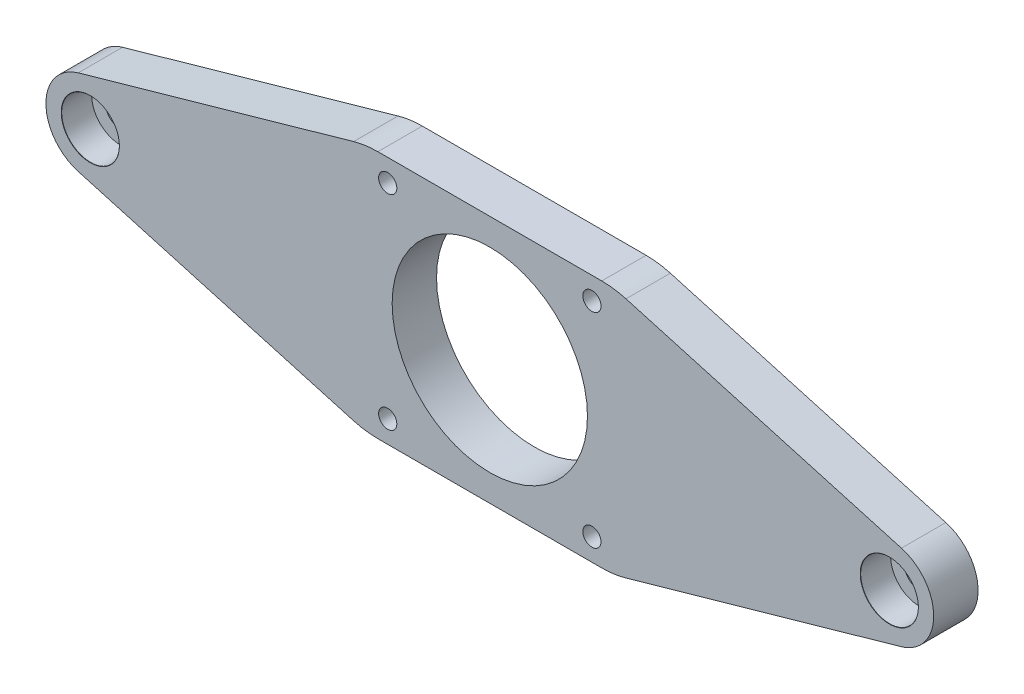
ISO-10303-21;
HEADER;
FILE_DESCRIPTION(('STEP AP214'),'2;1');
FILE_NAME('part.step','',(''),(''),'','','');
FILE_SCHEMA(('AUTOMOTIVE_DESIGN { 1 0 10303 214 1 1 1 1 }'));
ENDSEC;
DATA;
#1=APPLICATION_CONTEXT('core data for automotive mechanical design processes');
#2=APPLICATION_PROTOCOL_DEFINITION('international standard','automotive_design',2000,#1);
#3=PRODUCT_CONTEXT('',#1,'mechanical');
#4=PRODUCT('Part','Part','',(#3));
#5=PRODUCT_RELATED_PRODUCT_CATEGORY('part','',(#4));
#6=PRODUCT_DEFINITION_FORMATION('','',#4);
#7=PRODUCT_DEFINITION_CONTEXT('part definition',#1,'design');
#8=PRODUCT_DEFINITION('design','',#6,#7);
#9=PRODUCT_DEFINITION_SHAPE('','',#8);
#10=(LENGTH_UNIT() NAMED_UNIT(*) SI_UNIT(.MILLI.,.METRE.));
#11=(NAMED_UNIT(*) PLANE_ANGLE_UNIT() SI_UNIT($,.RADIAN.));
#12=(NAMED_UNIT(*) SI_UNIT($,.STERADIAN.) SOLID_ANGLE_UNIT());
#13=UNCERTAINTY_MEASURE_WITH_UNIT(LENGTH_MEASURE(1.E-05),#10,'distance_accuracy_value','');
#14=(GEOMETRIC_REPRESENTATION_CONTEXT(3) GLOBAL_UNCERTAINTY_ASSIGNED_CONTEXT((#13)) GLOBAL_UNIT_ASSIGNED_CONTEXT((#10,
#11,#12)) REPRESENTATION_CONTEXT('',''));
#15=CARTESIAN_POINT('',(0.,0.,0.));
#16=DIRECTION('',(0.,0.,1.));
#17=DIRECTION('',(1.,0.,0.));
#18=AXIS2_PLACEMENT_3D('',#15,#16,#17);
#19=CARTESIAN_POINT('',(-45.,0.,5.));
#20=DIRECTION('',(0.,0.,-1.));
#21=DIRECTION('',(-1.,0.,0.));
#22=AXIS2_PLACEMENT_3D('',#19,#20,#21);
#23=CYLINDRICAL_SURFACE('',#22,5.);
#24=CARTESIAN_POINT('',(-45.,0.,0.));
#25=DIRECTION('',(0.,0.,-1.));
#26=DIRECTION('',(-1.,0.,0.));
#27=AXIS2_PLACEMENT_3D('',#24,#25,#26);
#28=CIRCLE('',#27,5.);
#29=CARTESIAN_POINT('',(-46.3657429021405,-4.8098592833109,0.));
#30=VERTEX_POINT('',#29);
#31=CARTESIAN_POINT('',(-46.3657429021404,4.80985928331099,0.));
#32=VERTEX_POINT('',#31);
#33=EDGE_CURVE('E199',#30,#32,#28,.T.);
#34=ORIENTED_EDGE('',*,*,#33,.F.);
#35=DIRECTION('',(0.,0.,-1.));
#36=VECTOR('',#35,1.);
#37=CARTESIAN_POINT('',(-46.3657429021405,-4.8098592833109,5.));
#38=LINE('',#37,#36);
#39=CARTESIAN_POINT('',(-46.3657429021405,-4.8098592833109,5.));
#40=VERTEX_POINT('',#39);
#41=EDGE_CURVE('E183',#40,#30,#38,.T.);
#42=ORIENTED_EDGE('',*,*,#41,.F.);
#43=CARTESIAN_POINT('',(-45.,0.,5.));
#44=DIRECTION('',(0.,0.,-1.));
#45=DIRECTION('',(-1.,0.,0.));
#46=AXIS2_PLACEMENT_3D('',#43,#44,#45);
#47=CIRCLE('',#46,5.);
#48=CARTESIAN_POINT('',(-46.3657429021404,4.80985928331099,5.));
#49=VERTEX_POINT('',#48);
#50=EDGE_CURVE('E200',#40,#49,#47,.T.);
#51=ORIENTED_EDGE('',*,*,#50,.T.);
#52=DIRECTION('',(0.,0.,-1.));
#53=VECTOR('',#52,1.);
#54=CARTESIAN_POINT('',(-46.3657429021404,4.80985928331099,5.));
#55=LINE('',#54,#53);
#56=EDGE_CURVE('E212',#49,#32,#55,.T.);
#57=ORIENTED_EDGE('',*,*,#56,.T.);
#58=EDGE_LOOP('',(#34,#42,#51,#57));
#59=FACE_BOUND('',#58,.T.);
#60=ADVANCED_FACE('F37',(#59),#23,.T.);
#61=CARTESIAN_POINT('',(0.,0.,5.));
#62=DIRECTION('',(0.,0.,-1.));
#63=DIRECTION('',(-1.,0.,0.));
#64=AXIS2_PLACEMENT_3D('',#61,#62,#63);
#65=CYLINDRICAL_SURFACE('',#64,11.);
#66=CARTESIAN_POINT('',(0.,0.,0.));
#67=DIRECTION('',(0.,0.,-1.));
#68=DIRECTION('',(-1.,0.,0.));
#69=AXIS2_PLACEMENT_3D('',#66,#67,#68);
#70=CIRCLE('',#69,11.);
#71=CARTESIAN_POINT('',(-11.,0.,0.));
#72=VERTEX_POINT('',#71);
#73=EDGE_CURVE('E204',#72,#72,#70,.T.);
#74=ORIENTED_EDGE('',*,*,#73,.T.);
#75=EDGE_LOOP('',(#74));
#76=FACE_BOUND('',#75,.T.);
#77=CARTESIAN_POINT('',(0.,0.,5.));
#78=DIRECTION('',(0.,0.,-1.));
#79=DIRECTION('',(-1.,0.,0.));
#80=AXIS2_PLACEMENT_3D('',#77,#78,#79);
#81=CIRCLE('',#80,11.);
#82=CARTESIAN_POINT('',(-11.,0.,5.));
#83=VERTEX_POINT('',#82);
#84=EDGE_CURVE('E209',#83,#83,#81,.T.);
#85=ORIENTED_EDGE('',*,*,#84,.F.);
#86=EDGE_LOOP('',(#85));
#87=FACE_BOUND('',#86,.T.);
#88=ADVANCED_FACE('F327',(#76,#87),#65,.F.);
#89=CARTESIAN_POINT('',(-14.,14.,5.));
#90=DIRECTION('',(0.,1.,0.));
#91=DIRECTION('',(0.,0.,1.));
#92=AXIS2_PLACEMENT_3D('',#89,#90,#91);
#93=PLANE('',#92);
#94=DIRECTION('',(1.,0.,0.));
#95=VECTOR('',#94,1.);
#96=CARTESIAN_POINT('',(-14.,14.,0.));
#97=LINE('',#96,#95);
#98=CARTESIAN_POINT('',(-12.6077854302519,14.,0.));
#99=VERTEX_POINT('',#98);
#100=CARTESIAN_POINT('',(12.6077854302519,13.9999999999999,0.));
#101=VERTEX_POINT('',#100);
#102=EDGE_CURVE('E217',#99,#101,#97,.T.);
#103=ORIENTED_EDGE('',*,*,#102,.F.);
#104=DIRECTION('',(0.,0.,-1.));
#105=VECTOR('',#104,1.);
#106=CARTESIAN_POINT('',(-12.6077854302519,14.,5.));
#107=LINE('',#106,#105);
#108=CARTESIAN_POINT('',(-12.6077854302519,14.,5.));
#109=VERTEX_POINT('',#108);
#110=EDGE_CURVE('E46',#99,#109,#107,.F.);
#111=ORIENTED_EDGE('',*,*,#110,.T.);
#112=DIRECTION('',(1.,0.,0.));
#113=VECTOR('',#112,1.);
#114=CARTESIAN_POINT('',(-14.,14.,5.));
#115=LINE('',#114,#113);
#116=CARTESIAN_POINT('',(12.6077854302519,13.9999999999999,5.));
#117=VERTEX_POINT('',#116);
#118=EDGE_CURVE('E207',#109,#117,#115,.T.);
#119=ORIENTED_EDGE('',*,*,#118,.T.);
#120=DIRECTION('',(0.,0.,-1.));
#121=VECTOR('',#120,1.);
#122=CARTESIAN_POINT('',(12.6077854302519,13.9999999999999,5.));
#123=LINE('',#122,#121);
#124=EDGE_CURVE('E171',#101,#117,#123,.F.);
#125=ORIENTED_EDGE('',*,*,#124,.F.);
#126=EDGE_LOOP('',(#103,#111,#119,#125));
#127=FACE_BOUND('',#126,.T.);
#128=ADVANCED_FACE('F301',(#127),#93,.T.);
#129=CARTESIAN_POINT('',(-46.3657429021404,4.80985928331099,5.));
#130=DIRECTION('',(-0.27314858042809,0.9619718566622,0.));
#131=DIRECTION('',(-0.9619718566622,-0.27314858042809,0.));
#132=AXIS2_PLACEMENT_3D('',#129,#130,#131);
#133=PLANE('',#132);
#134=DIRECTION('',(0.9619718566622,0.27314858042809,0.));
#135=VECTOR('',#134,1.);
#136=CARTESIAN_POINT('',(-46.3657429021404,4.80985928331099,5.));
#137=LINE('',#136,#135);
#138=CARTESIAN_POINT('',(-15.3392712345328,13.619718566622,5.));
#139=VERTEX_POINT('',#138);
#140=EDGE_CURVE('E203',#49,#139,#137,.T.);
#141=ORIENTED_EDGE('',*,*,#140,.T.);
#142=DIRECTION('',(0.,0.,-1.));
#143=VECTOR('',#142,1.);
#144=CARTESIAN_POINT('',(-15.3392712345328,13.619718566622,5.));
#145=LINE('',#144,#143);
#146=CARTESIAN_POINT('',(-15.3392712345328,13.619718566622,0.));
#147=VERTEX_POINT('',#146);
#148=EDGE_CURVE('E222',#139,#147,#145,.T.);
#149=ORIENTED_EDGE('',*,*,#148,.T.);
#150=DIRECTION('',(0.9619718566622,0.27314858042809,0.));
#151=VECTOR('',#150,1.);
#152=CARTESIAN_POINT('',(-46.3657429021404,4.80985928331099,0.));
#153=LINE('',#152,#151);
#154=EDGE_CURVE('E215',#32,#147,#153,.T.);
#155=ORIENTED_EDGE('',*,*,#154,.F.);
#156=ORIENTED_EDGE('',*,*,#56,.F.);
#157=EDGE_LOOP('',(#141,#149,#155,#156));
#158=FACE_BOUND('',#157,.T.);
#159=ADVANCED_FACE('F306',(#158),#133,.T.);
#160=CARTESIAN_POINT('',(-45.,0.,5.));
#161=DIRECTION('',(0.,0.,-1.));
#162=DIRECTION('',(-1.,0.,0.));
#163=AXIS2_PLACEMENT_3D('',#160,#161,#162);
#164=PLANE('',#163);
#165=CARTESIAN_POINT('',(-11.5,11.5,5.));
#166=DIRECTION('',(0.,0.,1.));
#167=DIRECTION('',(1.,0.,0.));
#168=AXIS2_PLACEMENT_3D('',#165,#166,#167);
#169=CIRCLE('',#168,1.025);
#170=CARTESIAN_POINT('',(-10.475,11.5,5.));
#171=VERTEX_POINT('',#170);
#172=EDGE_CURVE('E347',#171,#171,#169,.T.);
#173=ORIENTED_EDGE('',*,*,#172,.F.);
#174=EDGE_LOOP('',(#173));
#175=FACE_BOUND('',#174,.T.);
#176=CARTESIAN_POINT('',(11.5,11.5,5.));
#177=DIRECTION('',(0.,0.,1.));
#178=DIRECTION('',(1.,0.,0.));
#179=AXIS2_PLACEMENT_3D('',#176,#177,#178);
#180=CIRCLE('',#179,1.025);
#181=CARTESIAN_POINT('',(12.525,11.5,5.));
#182=VERTEX_POINT('',#181);
#183=EDGE_CURVE('E250',#182,#182,#180,.T.);
#184=ORIENTED_EDGE('',*,*,#183,.F.);
#185=EDGE_LOOP('',(#184));
#186=FACE_BOUND('',#185,.T.);
#187=CARTESIAN_POINT('',(11.5,-11.5,5.));
#188=DIRECTION('',(0.,0.,1.));
#189=DIRECTION('',(1.,0.,0.));
#190=AXIS2_PLACEMENT_3D('',#187,#188,#189);
#191=CIRCLE('',#190,1.025);
#192=CARTESIAN_POINT('',(12.525,-11.5,5.));
#193=VERTEX_POINT('',#192);
#194=EDGE_CURVE('E238',#193,#193,#191,.T.);
#195=ORIENTED_EDGE('',*,*,#194,.F.);
#196=EDGE_LOOP('',(#195));
#197=FACE_BOUND('',#196,.T.);
#198=CARTESIAN_POINT('',(-11.5,-11.5,5.));
#199=DIRECTION('',(0.,0.,1.));
#200=DIRECTION('',(1.,0.,0.));
#201=AXIS2_PLACEMENT_3D('',#198,#199,#200);
#202=CIRCLE('',#201,1.025);
#203=CARTESIAN_POINT('',(-10.475,-11.5,5.));
#204=VERTEX_POINT('',#203);
#205=EDGE_CURVE('E237',#204,#204,#202,.T.);
#206=ORIENTED_EDGE('',*,*,#205,.F.);
#207=EDGE_LOOP('',(#206));
#208=FACE_BOUND('',#207,.T.);
#209=CARTESIAN_POINT('',(-45.,0.,5.));
#210=DIRECTION('',(0.,0.,1.));
#211=DIRECTION('',(1.,0.,0.));
#212=AXIS2_PLACEMENT_3D('',#209,#210,#211);
#213=CIRCLE('',#212,3.275);
#214=CARTESIAN_POINT('',(-41.725,0.,5.));
#215=VERTEX_POINT('',#214);
#216=EDGE_CURVE('E256',#215,#215,#213,.T.);
#217=ORIENTED_EDGE('',*,*,#216,.F.);
#218=EDGE_LOOP('',(#217));
#219=FACE_BOUND('',#218,.T.);
#220=CARTESIAN_POINT('',(45.,-1.81860049673382E-13,5.));
#221=DIRECTION('',(0.,0.,1.));
#222=DIRECTION('',(1.,0.,0.));
#223=AXIS2_PLACEMENT_3D('',#220,#221,#222);
#224=CIRCLE('',#223,3.275);
#225=CARTESIAN_POINT('',(48.275,-1.81860049673382E-13,5.));
#226=VERTEX_POINT('',#225);
#227=EDGE_CURVE('E233',#226,#226,#224,.T.);
#228=ORIENTED_EDGE('',*,*,#227,.F.);
#229=EDGE_LOOP('',(#228));
#230=FACE_BOUND('',#229,.T.);
#231=CARTESIAN_POINT('',(12.6077854302519,3.99999999999995,5.));
#232=DIRECTION('',(0.,0.,1.));
#233=DIRECTION('',(1.,0.,0.));
#234=AXIS2_PLACEMENT_3D('',#231,#232,#233);
#235=CIRCLE('',#234,10.);
#236=CARTESIAN_POINT('',(15.3392712345328,13.6197185666219,5.));
#237=VERTEX_POINT('',#236);
#238=EDGE_CURVE('E174',#117,#237,#235,.F.);
#239=ORIENTED_EDGE('',*,*,#238,.F.);
#240=ORIENTED_EDGE('',*,*,#118,.F.);
#241=CARTESIAN_POINT('',(-12.6077854302519,4.,5.));
#242=DIRECTION('',(0.,0.,-1.));
#243=DIRECTION('',(-1.,0.,0.));
#244=AXIS2_PLACEMENT_3D('',#241,#242,#243);
#245=CIRCLE('',#244,10.);
#246=EDGE_CURVE('E11',#109,#139,#245,.F.);
#247=ORIENTED_EDGE('',*,*,#246,.T.);
#248=ORIENTED_EDGE('',*,*,#140,.F.);
#249=ORIENTED_EDGE('',*,*,#50,.F.);
#250=DIRECTION('',(0.961971856662199,-0.273148580428092,0.));
#251=VECTOR('',#250,1.);
#252=CARTESIAN_POINT('',(-46.3657429021405,-4.8098592833109,5.));
#253=LINE('',#252,#251);
#254=CARTESIAN_POINT('',(-15.3392712345328,-13.619718566622,5.));
#255=VERTEX_POINT('',#254);
#256=EDGE_CURVE('E177',#40,#255,#253,.T.);
#257=ORIENTED_EDGE('',*,*,#256,.T.);
#258=CARTESIAN_POINT('',(-12.6077854302519,-3.99999999999997,5.));
#259=DIRECTION('',(0.,0.,1.));
#260=DIRECTION('',(-1.,0.,0.));
#261=AXIS2_PLACEMENT_3D('',#258,#259,#260);
#262=CIRCLE('',#261,10.);
#263=CARTESIAN_POINT('',(-12.6077854302519,-14.,5.));
#264=VERTEX_POINT('',#263);
#265=EDGE_CURVE('E197',#264,#255,#262,.F.);
#266=ORIENTED_EDGE('',*,*,#265,.F.);
#267=DIRECTION('',(1.,0.,0.));
#268=VECTOR('',#267,1.);
#269=CARTESIAN_POINT('',(-14.,-14.,5.));
#270=LINE('',#269,#268);
#271=CARTESIAN_POINT('',(12.6077854302518,-14.,5.));
#272=VERTEX_POINT('',#271);
#273=EDGE_CURVE('E180',#264,#272,#270,.T.);
#274=ORIENTED_EDGE('',*,*,#273,.T.);
#275=CARTESIAN_POINT('',(12.6077854302519,-4.00000000000002,5.));
#276=DIRECTION('',(0.,0.,-1.));
#277=DIRECTION('',(1.,0.,0.));
#278=AXIS2_PLACEMENT_3D('',#275,#276,#277);
#279=CIRCLE('',#278,10.);
#280=CARTESIAN_POINT('',(15.3392712345327,-13.619718566622,5.));
#281=VERTEX_POINT('',#280);
#282=EDGE_CURVE('E137',#272,#281,#279,.F.);
#283=ORIENTED_EDGE('',*,*,#282,.T.);
#284=DIRECTION('',(-0.9619718566622,-0.273148580428088,0.));
#285=VECTOR('',#284,1.);
#286=CARTESIAN_POINT('',(46.3657429021404,-4.80985928331109,5.));
#287=LINE('',#286,#285);
#288=CARTESIAN_POINT('',(46.3657429021404,-4.80985928331109,5.));
#289=VERTEX_POINT('',#288);
#290=EDGE_CURVE('E127',#289,#281,#287,.T.);
#291=ORIENTED_EDGE('',*,*,#290,.F.);
#292=CARTESIAN_POINT('',(45.,-1.81860049673382E-13,5.));
#293=DIRECTION('',(0.,0.,1.));
#294=DIRECTION('',(1.,0.,0.));
#295=AXIS2_PLACEMENT_3D('',#292,#293,#294);
#296=CIRCLE('',#295,5.);
#297=CARTESIAN_POINT('',(46.3657429021405,4.80985928331081,5.));
#298=VERTEX_POINT('',#297);
#299=EDGE_CURVE('E134',#289,#298,#296,.T.);
#300=ORIENTED_EDGE('',*,*,#299,.T.);
#301=DIRECTION('',(-0.961971856662198,0.273148580428094,0.));
#302=VECTOR('',#301,1.);
#303=CARTESIAN_POINT('',(46.3657429021405,4.80985928331081,5.));
#304=LINE('',#303,#302);
#305=EDGE_CURVE('E153',#298,#237,#304,.T.);
#306=ORIENTED_EDGE('',*,*,#305,.T.);
#307=EDGE_LOOP('',(#239,#240,#247,#248,#249,#257,#266,#274,#283,#291,#300,#306));
#308=FACE_BOUND('',#307,.T.);
#309=ORIENTED_EDGE('',*,*,#84,.T.);
#310=EDGE_LOOP('',(#309));
#311=FACE_BOUND('',#310,.T.);
#312=ADVANCED_FACE('F130',(#175,#186,#197,#208,#219,#230,#308,#311),#164,.F.);
#313=CARTESIAN_POINT('',(-45.,0.,0.));
#314=DIRECTION('',(0.,0.,-1.));
#315=DIRECTION('',(-1.,0.,0.));
#316=AXIS2_PLACEMENT_3D('',#313,#314,#315);
#317=PLANE('',#316);
#318=CARTESIAN_POINT('',(-11.5,11.5,0.));
#319=DIRECTION('',(0.,0.,-1.));
#320=DIRECTION('',(-1.,0.,0.));
#321=AXIS2_PLACEMENT_3D('',#318,#319,#320);
#322=CIRCLE('',#321,1.025);
#323=CARTESIAN_POINT('',(-12.525,11.5,0.));
#324=VERTEX_POINT('',#323);
#325=EDGE_CURVE('E41',#324,#324,#322,.T.);
#326=ORIENTED_EDGE('',*,*,#325,.F.);
#327=EDGE_LOOP('',(#326));
#328=FACE_BOUND('',#327,.T.);
#329=CARTESIAN_POINT('',(11.5,11.5,0.));
#330=DIRECTION('',(0.,0.,-1.));
#331=DIRECTION('',(-1.,0.,0.));
#332=AXIS2_PLACEMENT_3D('',#329,#330,#331);
#333=CIRCLE('',#332,1.025);
#334=CARTESIAN_POINT('',(10.475,11.5,0.));
#335=VERTEX_POINT('',#334);
#336=EDGE_CURVE('E245',#335,#335,#333,.T.);
#337=ORIENTED_EDGE('',*,*,#336,.F.);
#338=EDGE_LOOP('',(#337));
#339=FACE_BOUND('',#338,.T.);
#340=CARTESIAN_POINT('',(11.5,-11.5,0.));
#341=DIRECTION('',(0.,0.,-1.));
#342=DIRECTION('',(-1.,0.,0.));
#343=AXIS2_PLACEMENT_3D('',#340,#341,#342);
#344=CIRCLE('',#343,1.025);
#345=CARTESIAN_POINT('',(10.475,-11.5,0.));
#346=VERTEX_POINT('',#345);
#347=EDGE_CURVE('E235',#346,#346,#344,.T.);
#348=ORIENTED_EDGE('',*,*,#347,.F.);
#349=EDGE_LOOP('',(#348));
#350=FACE_BOUND('',#349,.T.);
#351=CARTESIAN_POINT('',(-11.5,-11.5,0.));
#352=DIRECTION('',(0.,0.,-1.));
#353=DIRECTION('',(-1.,0.,0.));
#354=AXIS2_PLACEMENT_3D('',#351,#352,#353);
#355=CIRCLE('',#354,1.025);
#356=CARTESIAN_POINT('',(-12.525,-11.5,0.));
#357=VERTEX_POINT('',#356);
#358=EDGE_CURVE('E242',#357,#357,#355,.T.);
#359=ORIENTED_EDGE('',*,*,#358,.F.);
#360=EDGE_LOOP('',(#359));
#361=FACE_BOUND('',#360,.T.);
#362=CARTESIAN_POINT('',(-45.,0.,0.));
#363=DIRECTION('',(0.,0.,-1.));
#364=DIRECTION('',(-1.,0.,0.));
#365=AXIS2_PLACEMENT_3D('',#362,#363,#364);
#366=CIRCLE('',#365,1.7);
#367=CARTESIAN_POINT('',(-46.7,0.,0.));
#368=VERTEX_POINT('',#367);
#369=EDGE_CURVE('E231',#368,#368,#366,.T.);
#370=ORIENTED_EDGE('',*,*,#369,.F.);
#371=EDGE_LOOP('',(#370));
#372=FACE_BOUND('',#371,.T.);
#373=CARTESIAN_POINT('',(45.,-1.81860049673382E-13,0.));
#374=DIRECTION('',(0.,0.,-1.));
#375=DIRECTION('',(-1.,0.,0.));
#376=AXIS2_PLACEMENT_3D('',#373,#374,#375);
#377=CIRCLE('',#376,1.7);
#378=CARTESIAN_POINT('',(43.3,-1.81860049673382E-13,0.));
#379=VERTEX_POINT('',#378);
#380=EDGE_CURVE('E227',#379,#379,#377,.T.);
#381=ORIENTED_EDGE('',*,*,#380,.F.);
#382=EDGE_LOOP('',(#381));
#383=FACE_BOUND('',#382,.T.);
#384=ORIENTED_EDGE('',*,*,#102,.T.);
#385=CARTESIAN_POINT('',(12.6077854302519,3.99999999999995,0.));
#386=DIRECTION('',(0.,0.,1.));
#387=DIRECTION('',(1.,0.,0.));
#388=AXIS2_PLACEMENT_3D('',#385,#386,#387);
#389=CIRCLE('',#388,10.);
#390=CARTESIAN_POINT('',(15.3392712345328,13.6197185666219,0.));
#391=VERTEX_POINT('',#390);
#392=EDGE_CURVE('E168',#391,#101,#389,.T.);
#393=ORIENTED_EDGE('',*,*,#392,.F.);
#394=DIRECTION('',(-0.961971856662198,0.273148580428094,0.));
#395=VECTOR('',#394,1.);
#396=CARTESIAN_POINT('',(46.3657429021405,4.80985928331081,0.));
#397=LINE('',#396,#395);
#398=CARTESIAN_POINT('',(46.3657429021405,4.80985928331081,0.));
#399=VERTEX_POINT('',#398);
#400=EDGE_CURVE('E154',#399,#391,#397,.T.);
#401=ORIENTED_EDGE('',*,*,#400,.F.);
#402=CARTESIAN_POINT('',(45.,-1.81860049673382E-13,0.));
#403=DIRECTION('',(0.,0.,1.));
#404=DIRECTION('',(1.,0.,0.));
#405=AXIS2_PLACEMENT_3D('',#402,#403,#404);
#406=CIRCLE('',#405,5.);
#407=CARTESIAN_POINT('',(46.3657429021404,-4.80985928331109,0.));
#408=VERTEX_POINT('',#407);
#409=EDGE_CURVE('E158',#408,#399,#406,.T.);
#410=ORIENTED_EDGE('',*,*,#409,.F.);
#411=DIRECTION('',(-0.9619718566622,-0.273148580428088,0.));
#412=VECTOR('',#411,1.);
#413=CARTESIAN_POINT('',(46.3657429021404,-4.80985928331109,0.));
#414=LINE('',#413,#412);
#415=CARTESIAN_POINT('',(15.3392712345327,-13.619718566622,0.));
#416=VERTEX_POINT('',#415);
#417=EDGE_CURVE('E140',#408,#416,#414,.T.);
#418=ORIENTED_EDGE('',*,*,#417,.T.);
#419=CARTESIAN_POINT('',(12.6077854302519,-4.00000000000002,0.));
#420=DIRECTION('',(0.,0.,-1.));
#421=DIRECTION('',(1.,0.,0.));
#422=AXIS2_PLACEMENT_3D('',#419,#420,#421);
#423=CIRCLE('',#422,10.);
#424=CARTESIAN_POINT('',(12.6077854302518,-14.,0.));
#425=VERTEX_POINT('',#424);
#426=EDGE_CURVE('E279',#416,#425,#423,.T.);
#427=ORIENTED_EDGE('',*,*,#426,.T.);
#428=DIRECTION('',(1.,0.,0.));
#429=VECTOR('',#428,1.);
#430=CARTESIAN_POINT('',(-14.,-14.,0.));
#431=LINE('',#430,#429);
#432=CARTESIAN_POINT('',(-12.6077854302519,-14.,0.));
#433=VERTEX_POINT('',#432);
#434=EDGE_CURVE('E181',#433,#425,#431,.T.);
#435=ORIENTED_EDGE('',*,*,#434,.F.);
#436=CARTESIAN_POINT('',(-12.6077854302519,-3.99999999999997,0.));
#437=DIRECTION('',(0.,0.,1.));
#438=DIRECTION('',(-1.,0.,0.));
#439=AXIS2_PLACEMENT_3D('',#436,#437,#438);
#440=CIRCLE('',#439,10.);
#441=CARTESIAN_POINT('',(-15.3392712345328,-13.619718566622,0.));
#442=VERTEX_POINT('',#441);
#443=EDGE_CURVE('E192',#442,#433,#440,.T.);
#444=ORIENTED_EDGE('',*,*,#443,.F.);
#445=DIRECTION('',(0.961971856662199,-0.273148580428092,0.));
#446=VECTOR('',#445,1.);
#447=CARTESIAN_POINT('',(-46.3657429021405,-4.8098592833109,0.));
#448=LINE('',#447,#446);
#449=EDGE_CURVE('E176',#30,#442,#448,.T.);
#450=ORIENTED_EDGE('',*,*,#449,.F.);
#451=ORIENTED_EDGE('',*,*,#33,.T.);
#452=ORIENTED_EDGE('',*,*,#154,.T.);
#453=CARTESIAN_POINT('',(-12.6077854302519,4.,0.));
#454=DIRECTION('',(0.,0.,-1.));
#455=DIRECTION('',(-1.,0.,0.));
#456=AXIS2_PLACEMENT_3D('',#453,#454,#455);
#457=CIRCLE('',#456,10.);
#458=EDGE_CURVE('E61',#147,#99,#457,.T.);
#459=ORIENTED_EDGE('',*,*,#458,.T.);
#460=EDGE_LOOP('',(#384,#393,#401,#410,#418,#427,#435,#444,#450,#451,#452,#459));
#461=FACE_BOUND('',#460,.T.);
#462=ORIENTED_EDGE('',*,*,#73,.F.);
#463=EDGE_LOOP('',(#462));
#464=FACE_BOUND('',#463,.T.);
#465=ADVANCED_FACE('F292',(#328,#339,#350,#361,#372,#383,#461,#464),#317,.T.);
#466=CARTESIAN_POINT('',(-12.6077854302519,4.,5.));
#467=DIRECTION('',(0.,0.,-1.));
#468=DIRECTION('',(-1.,0.,0.));
#469=AXIS2_PLACEMENT_3D('',#466,#467,#468);
#470=CYLINDRICAL_SURFACE('',#469,10.);
#471=ORIENTED_EDGE('',*,*,#246,.F.);
#472=ORIENTED_EDGE('',*,*,#110,.F.);
#473=ORIENTED_EDGE('',*,*,#458,.F.);
#474=ORIENTED_EDGE('',*,*,#148,.F.);
#475=EDGE_LOOP('',(#471,#472,#473,#474));
#476=FACE_BOUND('',#475,.T.);
#477=ADVANCED_FACE('F39',(#476),#470,.T.);
#478=CARTESIAN_POINT('',(-14.,-14.,5.));
#479=DIRECTION('',(0.,-1.,0.));
#480=DIRECTION('',(0.,0.,1.));
#481=AXIS2_PLACEMENT_3D('',#478,#479,#480);
#482=PLANE('',#481);
#483=ORIENTED_EDGE('',*,*,#434,.T.);
#484=DIRECTION('',(0.,0.,-1.));
#485=VECTOR('',#484,1.);
#486=CARTESIAN_POINT('',(12.6077854302518,-14.,5.));
#487=LINE('',#486,#485);
#488=EDGE_CURVE('E281',#425,#272,#487,.F.);
#489=ORIENTED_EDGE('',*,*,#488,.T.);
#490=ORIENTED_EDGE('',*,*,#273,.F.);
#491=DIRECTION('',(0.,0.,-1.));
#492=VECTOR('',#491,1.);
#493=CARTESIAN_POINT('',(-12.6077854302519,-14.,5.));
#494=LINE('',#493,#492);
#495=EDGE_CURVE('E194',#433,#264,#494,.F.);
#496=ORIENTED_EDGE('',*,*,#495,.F.);
#497=EDGE_LOOP('',(#483,#489,#490,#496));
#498=FACE_BOUND('',#497,.T.);
#499=ADVANCED_FACE('F286',(#498),#482,.T.);
#500=CARTESIAN_POINT('',(-46.3657429021405,-4.8098592833109,5.));
#501=DIRECTION('',(-0.273148580428092,-0.961971856662199,0.));
#502=DIRECTION('',(-0.961971856662199,0.273148580428092,0.));
#503=AXIS2_PLACEMENT_3D('',#500,#501,#502);
#504=PLANE('',#503);
#505=ORIENTED_EDGE('',*,*,#256,.F.);
#506=ORIENTED_EDGE('',*,*,#41,.T.);
#507=ORIENTED_EDGE('',*,*,#449,.T.);
#508=DIRECTION('',(0.,0.,-1.));
#509=VECTOR('',#508,1.);
#510=CARTESIAN_POINT('',(-15.3392712345328,-13.619718566622,5.));
#511=LINE('',#510,#509);
#512=EDGE_CURVE('E189',#255,#442,#511,.T.);
#513=ORIENTED_EDGE('',*,*,#512,.F.);
#514=EDGE_LOOP('',(#505,#506,#507,#513));
#515=FACE_BOUND('',#514,.T.);
#516=ADVANCED_FACE('F314',(#515),#504,.T.);
#517=CARTESIAN_POINT('',(-12.6077854302519,-3.99999999999997,5.));
#518=DIRECTION('',(0.,0.,-1.));
#519=DIRECTION('',(-1.,0.,0.));
#520=AXIS2_PLACEMENT_3D('',#517,#518,#519);
#521=CYLINDRICAL_SURFACE('',#520,10.);
#522=ORIENTED_EDGE('',*,*,#265,.T.);
#523=ORIENTED_EDGE('',*,*,#512,.T.);
#524=ORIENTED_EDGE('',*,*,#443,.T.);
#525=ORIENTED_EDGE('',*,*,#495,.T.);
#526=EDGE_LOOP('',(#522,#523,#524,#525));
#527=FACE_BOUND('',#526,.T.);
#528=ADVANCED_FACE('F316',(#527),#521,.T.);
#529=CARTESIAN_POINT('',(45.,-1.81860049673382E-13,5.));
#530=DIRECTION('',(0.,0.,-1.));
#531=DIRECTION('',(1.,0.,0.));
#532=AXIS2_PLACEMENT_3D('',#529,#530,#531);
#533=CYLINDRICAL_SURFACE('',#532,5.);
#534=ORIENTED_EDGE('',*,*,#409,.T.);
#535=DIRECTION('',(0.,0.,-1.));
#536=VECTOR('',#535,1.);
#537=CARTESIAN_POINT('',(46.3657429021405,4.80985928331081,5.));
#538=LINE('',#537,#536);
#539=EDGE_CURVE('E152',#298,#399,#538,.T.);
#540=ORIENTED_EDGE('',*,*,#539,.F.);
#541=ORIENTED_EDGE('',*,*,#299,.F.);
#542=DIRECTION('',(0.,0.,-1.));
#543=VECTOR('',#542,1.);
#544=CARTESIAN_POINT('',(46.3657429021404,-4.80985928331109,5.));
#545=LINE('',#544,#543);
#546=EDGE_CURVE('E139',#289,#408,#545,.T.);
#547=ORIENTED_EDGE('',*,*,#546,.T.);
#548=EDGE_LOOP('',(#534,#540,#541,#547));
#549=FACE_BOUND('',#548,.T.);
#550=ADVANCED_FACE('F150',(#549),#533,.T.);
#551=CARTESIAN_POINT('',(46.3657429021405,4.80985928331081,5.));
#552=DIRECTION('',(0.273148580428094,0.961971856662198,0.));
#553=DIRECTION('',(0.961971856662198,-0.273148580428094,0.));
#554=AXIS2_PLACEMENT_3D('',#551,#552,#553);
#555=PLANE('',#554);
#556=ORIENTED_EDGE('',*,*,#305,.F.);
#557=ORIENTED_EDGE('',*,*,#539,.T.);
#558=ORIENTED_EDGE('',*,*,#400,.T.);
#559=DIRECTION('',(0.,0.,-1.));
#560=VECTOR('',#559,1.);
#561=CARTESIAN_POINT('',(15.3392712345328,13.6197185666219,5.));
#562=LINE('',#561,#560);
#563=EDGE_CURVE('E165',#237,#391,#562,.T.);
#564=ORIENTED_EDGE('',*,*,#563,.F.);
#565=EDGE_LOOP('',(#556,#557,#558,#564));
#566=FACE_BOUND('',#565,.T.);
#567=ADVANCED_FACE('F296',(#566),#555,.T.);
#568=CARTESIAN_POINT('',(12.6077854302519,3.99999999999995,5.));
#569=DIRECTION('',(0.,0.,-1.));
#570=DIRECTION('',(1.,0.,0.));
#571=AXIS2_PLACEMENT_3D('',#568,#569,#570);
#572=CYLINDRICAL_SURFACE('',#571,10.);
#573=ORIENTED_EDGE('',*,*,#238,.T.);
#574=ORIENTED_EDGE('',*,*,#563,.T.);
#575=ORIENTED_EDGE('',*,*,#392,.T.);
#576=ORIENTED_EDGE('',*,*,#124,.T.);
#577=EDGE_LOOP('',(#573,#574,#575,#576));
#578=FACE_BOUND('',#577,.T.);
#579=ADVANCED_FACE('F300',(#578),#572,.T.);
#580=CARTESIAN_POINT('',(46.3657429021404,-4.80985928331109,5.));
#581=DIRECTION('',(0.273148580428088,-0.9619718566622,0.));
#582=DIRECTION('',(0.9619718566622,0.273148580428088,0.));
#583=AXIS2_PLACEMENT_3D('',#580,#581,#582);
#584=PLANE('',#583);
#585=ORIENTED_EDGE('',*,*,#290,.T.);
#586=DIRECTION('',(0.,0.,-1.));
#587=VECTOR('',#586,1.);
#588=CARTESIAN_POINT('',(15.3392712345327,-13.619718566622,5.));
#589=LINE('',#588,#587);
#590=EDGE_CURVE('E148',#281,#416,#589,.T.);
#591=ORIENTED_EDGE('',*,*,#590,.T.);
#592=ORIENTED_EDGE('',*,*,#417,.F.);
#593=ORIENTED_EDGE('',*,*,#546,.F.);
#594=EDGE_LOOP('',(#585,#591,#592,#593));
#595=FACE_BOUND('',#594,.T.);
#596=ADVANCED_FACE('F143',(#595),#584,.T.);
#597=CARTESIAN_POINT('',(12.6077854302519,-4.00000000000002,5.));
#598=DIRECTION('',(0.,0.,-1.));
#599=DIRECTION('',(1.,0.,0.));
#600=AXIS2_PLACEMENT_3D('',#597,#598,#599);
#601=CYLINDRICAL_SURFACE('',#600,10.);
#602=ORIENTED_EDGE('',*,*,#282,.F.);
#603=ORIENTED_EDGE('',*,*,#488,.F.);
#604=ORIENTED_EDGE('',*,*,#426,.F.);
#605=ORIENTED_EDGE('',*,*,#590,.F.);
#606=EDGE_LOOP('',(#602,#603,#604,#605));
#607=FACE_BOUND('',#606,.T.);
#608=ADVANCED_FACE('F291',(#607),#601,.T.);
#609=CARTESIAN_POINT('',(45.,-1.81860049673382E-13,5.));
#610=DIRECTION('',(0.,0.,1.));
#611=DIRECTION('',(1.,0.,0.));
#612=AXIS2_PLACEMENT_3D('',#609,#610,#611);
#613=CYLINDRICAL_SURFACE('',#612,1.7);
#614=ORIENTED_EDGE('',*,*,#380,.T.);
#615=EDGE_LOOP('',(#614));
#616=FACE_BOUND('',#615,.T.);
#617=CARTESIAN_POINT('',(45.,-1.81860049673382E-13,1.6));
#618=DIRECTION('',(0.,0.,1.));
#619=DIRECTION('',(1.,0.,0.));
#620=AXIS2_PLACEMENT_3D('',#617,#618,#619);
#621=CIRCLE('',#620,1.7);
#622=CARTESIAN_POINT('',(46.7,-1.81860049673382E-13,1.6));
#623=VERTEX_POINT('',#622);
#624=EDGE_CURVE('E230',#623,#623,#621,.T.);
#625=ORIENTED_EDGE('',*,*,#624,.T.);
#626=EDGE_LOOP('',(#625));
#627=FACE_BOUND('',#626,.T.);
#628=ADVANCED_FACE('F379',(#616,#627),#613,.F.);
#629=CARTESIAN_POINT('',(46.7,-1.81860049673382E-13,1.6));
#630=DIRECTION('',(0.,0.,-1.));
#631=DIRECTION('',(-1.,0.,0.));
#632=AXIS2_PLACEMENT_3D('',#629,#630,#631);
#633=PLANE('',#632);
#634=ORIENTED_EDGE('',*,*,#624,.F.);
#635=EDGE_LOOP('',(#634));
#636=FACE_BOUND('',#635,.T.);
#637=CARTESIAN_POINT('',(45.,-1.81860049673382E-13,1.6));
#638=DIRECTION('',(0.,0.,1.));
#639=DIRECTION('',(1.,0.,0.));
#640=AXIS2_PLACEMENT_3D('',#637,#638,#639);
#641=CIRCLE('',#640,3.25);
#642=CARTESIAN_POINT('',(48.25,-1.81860049673382E-13,1.6));
#643=VERTEX_POINT('',#642);
#644=EDGE_CURVE('E272',#643,#643,#641,.T.);
#645=ORIENTED_EDGE('',*,*,#644,.T.);
#646=EDGE_LOOP('',(#645));
#647=FACE_BOUND('',#646,.T.);
#648=ADVANCED_FACE('F371',(#636,#647),#633,.F.);
#649=CARTESIAN_POINT('',(45.,-1.81860049673382E-13,5.));
#650=DIRECTION('',(0.,0.,1.));
#651=DIRECTION('',(1.,0.,0.));
#652=AXIS2_PLACEMENT_3D('',#649,#650,#651);
#653=CYLINDRICAL_SURFACE('',#652,3.25);
#654=ORIENTED_EDGE('',*,*,#644,.F.);
#655=EDGE_LOOP('',(#654));
#656=FACE_BOUND('',#655,.T.);
#657=CARTESIAN_POINT('',(45.,-1.81860049673382E-13,4.975));
#658=DIRECTION('',(0.,0.,1.));
#659=DIRECTION('',(1.,0.,0.));
#660=AXIS2_PLACEMENT_3D('',#657,#658,#659);
#661=CIRCLE('',#660,3.25);
#662=CARTESIAN_POINT('',(48.25,-1.81860049673382E-13,4.975));
#663=VERTEX_POINT('',#662);
#664=EDGE_CURVE('E269',#663,#663,#661,.T.);
#665=ORIENTED_EDGE('',*,*,#664,.T.);
#666=EDGE_LOOP('',(#665));
#667=FACE_BOUND('',#666,.T.);
#668=ADVANCED_FACE('F361',(#656,#667),#653,.F.);
#669=CARTESIAN_POINT('',(45.,-1.81860049673382E-13,5.));
#670=DIRECTION('',(0.,0.,1.));
#671=DIRECTION('',(1.,0.,0.));
#672=AXIS2_PLACEMENT_3D('',#669,#670,#671);
#673=CONICAL_SURFACE('',#672,3.275,0.785398163397379);
#674=ORIENTED_EDGE('',*,*,#664,.F.);
#675=EDGE_LOOP('',(#674));
#676=FACE_BOUND('',#675,.T.);
#677=ORIENTED_EDGE('',*,*,#227,.T.);
#678=EDGE_LOOP('',(#677));
#679=FACE_BOUND('',#678,.T.);
#680=ADVANCED_FACE('F358',(#676,#679),#673,.F.);
#681=CARTESIAN_POINT('',(-45.,0.,5.));
#682=DIRECTION('',(0.,0.,1.));
#683=DIRECTION('',(1.,0.,0.));
#684=AXIS2_PLACEMENT_3D('',#681,#682,#683);
#685=CYLINDRICAL_SURFACE('',#684,1.7);
#686=ORIENTED_EDGE('',*,*,#369,.T.);
#687=EDGE_LOOP('',(#686));
#688=FACE_BOUND('',#687,.T.);
#689=CARTESIAN_POINT('',(-45.,0.,1.6));
#690=DIRECTION('',(0.,0.,1.));
#691=DIRECTION('',(1.,0.,0.));
#692=AXIS2_PLACEMENT_3D('',#689,#690,#691);
#693=CIRCLE('',#692,1.7);
#694=CARTESIAN_POINT('',(-43.3,0.,1.6));
#695=VERTEX_POINT('',#694);
#696=EDGE_CURVE('E234',#695,#695,#693,.T.);
#697=ORIENTED_EDGE('',*,*,#696,.T.);
#698=EDGE_LOOP('',(#697));
#699=FACE_BOUND('',#698,.T.);
#700=ADVANCED_FACE('F360',(#688,#699),#685,.F.);
#701=CARTESIAN_POINT('',(-43.3,0.,1.6));
#702=DIRECTION('',(0.,0.,-1.));
#703=DIRECTION('',(-1.,0.,0.));
#704=AXIS2_PLACEMENT_3D('',#701,#702,#703);
#705=PLANE('',#704);
#706=ORIENTED_EDGE('',*,*,#696,.F.);
#707=EDGE_LOOP('',(#706));
#708=FACE_BOUND('',#707,.T.);
#709=CARTESIAN_POINT('',(-45.,0.,1.6));
#710=DIRECTION('',(0.,0.,1.));
#711=DIRECTION('',(1.,0.,0.));
#712=AXIS2_PLACEMENT_3D('',#709,#710,#711);
#713=CIRCLE('',#712,3.25);
#714=CARTESIAN_POINT('',(-41.75,0.,1.6));
#715=VERTEX_POINT('',#714);
#716=EDGE_CURVE('E262',#715,#715,#713,.T.);
#717=ORIENTED_EDGE('',*,*,#716,.T.);
#718=EDGE_LOOP('',(#717));
#719=FACE_BOUND('',#718,.T.);
#720=ADVANCED_FACE('F368',(#708,#719),#705,.F.);
#721=CARTESIAN_POINT('',(-45.,0.,5.));
#722=DIRECTION('',(0.,0.,1.));
#723=DIRECTION('',(1.,0.,0.));
#724=AXIS2_PLACEMENT_3D('',#721,#722,#723);
#725=CYLINDRICAL_SURFACE('',#724,3.25);
#726=ORIENTED_EDGE('',*,*,#716,.F.);
#727=EDGE_LOOP('',(#726));
#728=FACE_BOUND('',#727,.T.);
#729=CARTESIAN_POINT('',(-45.,0.,4.975));
#730=DIRECTION('',(0.,0.,1.));
#731=DIRECTION('',(1.,0.,0.));
#732=AXIS2_PLACEMENT_3D('',#729,#730,#731);
#733=CIRCLE('',#732,3.25);
#734=CARTESIAN_POINT('',(-41.75,0.,4.975));
#735=VERTEX_POINT('',#734);
#736=EDGE_CURVE('E259',#735,#735,#733,.T.);
#737=ORIENTED_EDGE('',*,*,#736,.T.);
#738=EDGE_LOOP('',(#737));
#739=FACE_BOUND('',#738,.T.);
#740=ADVANCED_FACE('F480',(#728,#739),#725,.F.);
#741=CARTESIAN_POINT('',(-45.,0.,5.));
#742=DIRECTION('',(0.,0.,1.));
#743=DIRECTION('',(1.,0.,0.));
#744=AXIS2_PLACEMENT_3D('',#741,#742,#743);
#745=CONICAL_SURFACE('',#744,3.275,0.785398163397379);
#746=ORIENTED_EDGE('',*,*,#736,.F.);
#747=EDGE_LOOP('',(#746));
#748=FACE_BOUND('',#747,.T.);
#749=ORIENTED_EDGE('',*,*,#216,.T.);
#750=EDGE_LOOP('',(#749));
#751=FACE_BOUND('',#750,.T.);
#752=ADVANCED_FACE('F423',(#748,#751),#745,.F.);
#753=CARTESIAN_POINT('',(-11.5,-11.5,5.));
#754=DIRECTION('',(0.,0.,1.));
#755=DIRECTION('',(1.,0.,0.));
#756=AXIS2_PLACEMENT_3D('',#753,#754,#755);
#757=CYLINDRICAL_SURFACE('',#756,1.025);
#758=ORIENTED_EDGE('',*,*,#358,.T.);
#759=EDGE_LOOP('',(#758));
#760=FACE_BOUND('',#759,.T.);
#761=ORIENTED_EDGE('',*,*,#205,.T.);
#762=EDGE_LOOP('',(#761));
#763=FACE_BOUND('',#762,.T.);
#764=ADVANCED_FACE('F416',(#760,#763),#757,.F.);
#765=CARTESIAN_POINT('',(11.5,-11.5,5.));
#766=DIRECTION('',(0.,0.,1.));
#767=DIRECTION('',(1.,0.,0.));
#768=AXIS2_PLACEMENT_3D('',#765,#766,#767);
#769=CYLINDRICAL_SURFACE('',#768,1.025);
#770=ORIENTED_EDGE('',*,*,#347,.T.);
#771=EDGE_LOOP('',(#770));
#772=FACE_BOUND('',#771,.T.);
#773=ORIENTED_EDGE('',*,*,#194,.T.);
#774=EDGE_LOOP('',(#773));
#775=FACE_BOUND('',#774,.T.);
#776=ADVANCED_FACE('F422',(#772,#775),#769,.F.);
#777=CARTESIAN_POINT('',(11.5,11.5,5.));
#778=DIRECTION('',(0.,0.,1.));
#779=DIRECTION('',(1.,0.,0.));
#780=AXIS2_PLACEMENT_3D('',#777,#778,#779);
#781=CYLINDRICAL_SURFACE('',#780,1.025);
#782=ORIENTED_EDGE('',*,*,#336,.T.);
#783=EDGE_LOOP('',(#782));
#784=FACE_BOUND('',#783,.T.);
#785=ORIENTED_EDGE('',*,*,#183,.T.);
#786=EDGE_LOOP('',(#785));
#787=FACE_BOUND('',#786,.T.);
#788=ADVANCED_FACE('F436',(#784,#787),#781,.F.);
#789=CARTESIAN_POINT('',(-11.5,11.5,5.));
#790=DIRECTION('',(0.,0.,1.));
#791=DIRECTION('',(1.,0.,0.));
#792=AXIS2_PLACEMENT_3D('',#789,#790,#791);
#793=CYLINDRICAL_SURFACE('',#792,1.025);
#794=ORIENTED_EDGE('',*,*,#325,.T.);
#795=EDGE_LOOP('',(#794));
#796=FACE_BOUND('',#795,.T.);
#797=ORIENTED_EDGE('',*,*,#172,.T.);
#798=EDGE_LOOP('',(#797));
#799=FACE_BOUND('',#798,.T.);
#800=ADVANCED_FACE('F447',(#796,#799),#793,.F.);
#801=CLOSED_SHELL('',(#60,#88,#128,#159,#312,#465,#477,#499,#516,#528,#550,#567,#579,#596,#608,
#628,#648,#668,#680,#700,#720,#740,#752,#764,#776,#788,#800));
#802=MANIFOLD_SOLID_BREP('B2',#801);
#803=ADVANCED_BREP_SHAPE_REPRESENTATION('',(#18,#802),#14);
#804=SHAPE_DEFINITION_REPRESENTATION(#9,#803);
ENDSEC;
END-ISO-10303-21;
